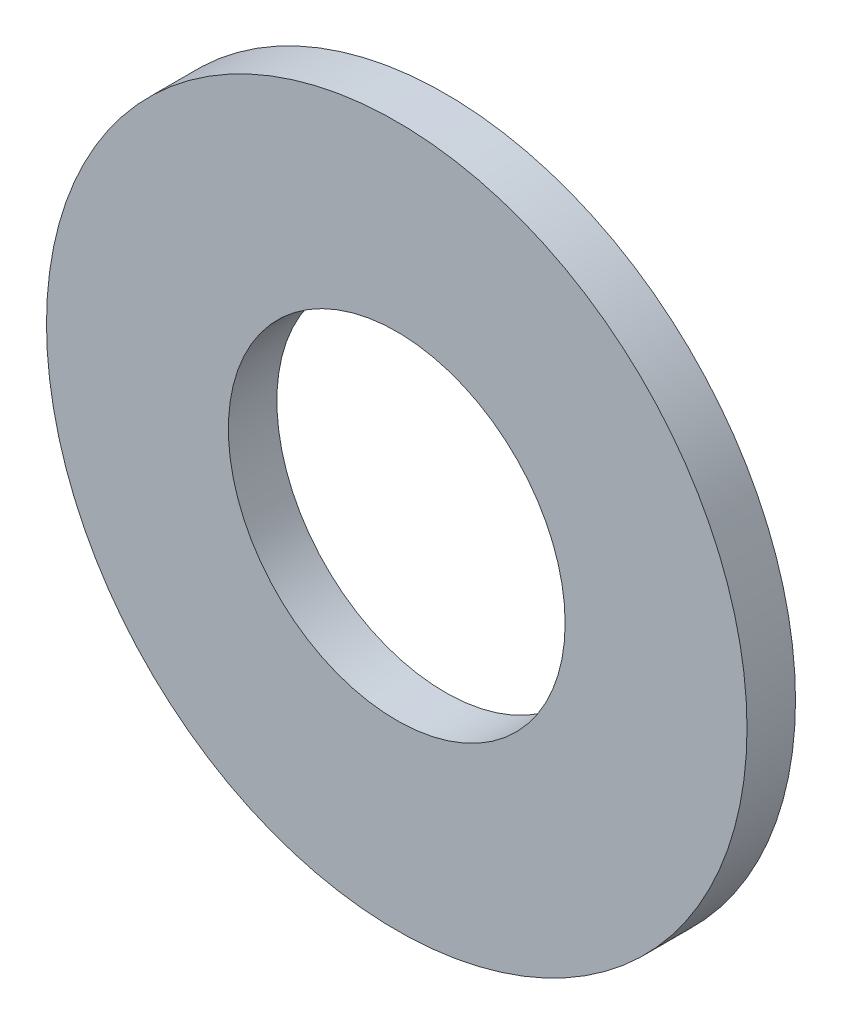
ISO-10303-21;
HEADER;
FILE_DESCRIPTION(('STEP AP214'),'2;1');
FILE_NAME('part.step','',(''),(''),'','','');
FILE_SCHEMA(('AUTOMOTIVE_DESIGN { 1 0 10303 214 1 1 1 1 }'));
ENDSEC;
DATA;
#1=APPLICATION_CONTEXT('core data for automotive mechanical design processes');
#2=APPLICATION_PROTOCOL_DEFINITION('international standard','automotive_design',2000,#1);
#3=PRODUCT_CONTEXT('',#1,'mechanical');
#4=PRODUCT('Part','Part','',(#3));
#5=PRODUCT_RELATED_PRODUCT_CATEGORY('part','',(#4));
#6=PRODUCT_DEFINITION_FORMATION('','',#4);
#7=PRODUCT_DEFINITION_CONTEXT('part definition',#1,'design');
#8=PRODUCT_DEFINITION('design','',#6,#7);
#9=PRODUCT_DEFINITION_SHAPE('','',#8);
#10=(LENGTH_UNIT() NAMED_UNIT(*) SI_UNIT(.MILLI.,.METRE.));
#11=(NAMED_UNIT(*) PLANE_ANGLE_UNIT() SI_UNIT($,.RADIAN.));
#12=(NAMED_UNIT(*) SI_UNIT($,.STERADIAN.) SOLID_ANGLE_UNIT());
#13=UNCERTAINTY_MEASURE_WITH_UNIT(LENGTH_MEASURE(1.E-05),#10,'distance_accuracy_value','');
#14=(GEOMETRIC_REPRESENTATION_CONTEXT(3) GLOBAL_UNCERTAINTY_ASSIGNED_CONTEXT((#13)) GLOBAL_UNIT_ASSIGNED_CONTEXT((#10,
#11,#12)) REPRESENTATION_CONTEXT('',''));
#15=CARTESIAN_POINT('',(0.,0.,0.));
#16=DIRECTION('',(0.,0.,1.));
#17=DIRECTION('',(1.,0.,0.));
#18=AXIS2_PLACEMENT_3D('',#15,#16,#17);
#19=CARTESIAN_POINT('',(0.,0.,3.6));
#20=DIRECTION('',(0.,0.,1.));
#21=DIRECTION('',(1.,0.,0.));
#22=AXIS2_PLACEMENT_3D('',#19,#20,#21);
#23=PLANE('',#22);
#24=CARTESIAN_POINT('',(0.,0.,3.6));
#25=DIRECTION('',(0.,0.,1.));
#26=DIRECTION('',(1.,0.,0.));
#27=AXIS2_PLACEMENT_3D('',#24,#25,#26);
#28=CIRCLE('',#27,26.);
#29=CARTESIAN_POINT('',(26.,0.,3.6));
#30=VERTEX_POINT('',#29);
#31=EDGE_CURVE('E10',#30,#30,#28,.T.);
#32=ORIENTED_EDGE('',*,*,#31,.T.);
#33=EDGE_LOOP('',(#32));
#34=FACE_BOUND('',#33,.T.);
#35=CARTESIAN_POINT('',(0.,0.,3.6));
#36=DIRECTION('',(0.,0.,1.));
#37=DIRECTION('',(1.,0.,0.));
#38=AXIS2_PLACEMENT_3D('',#35,#36,#37);
#39=CIRCLE('',#38,12.5);
#40=CARTESIAN_POINT('',(12.5,0.,3.6));
#41=VERTEX_POINT('',#40);
#42=EDGE_CURVE('E54',#41,#41,#39,.T.);
#43=ORIENTED_EDGE('',*,*,#42,.F.);
#44=EDGE_LOOP('',(#43));
#45=FACE_BOUND('',#44,.T.);
#46=ADVANCED_FACE('F41',(#34,#45),#23,.T.);
#47=CARTESIAN_POINT('',(0.,0.,0.));
#48=DIRECTION('',(0.,0.,1.));
#49=DIRECTION('',(1.,0.,0.));
#50=AXIS2_PLACEMENT_3D('',#47,#48,#49);
#51=PLANE('',#50);
#52=CARTESIAN_POINT('',(0.,0.,0.));
#53=DIRECTION('',(0.,0.,1.));
#54=DIRECTION('',(1.,0.,0.));
#55=AXIS2_PLACEMENT_3D('',#52,#53,#54);
#56=CIRCLE('',#55,26.);
#57=CARTESIAN_POINT('',(26.,0.,0.));
#58=VERTEX_POINT('',#57);
#59=EDGE_CURVE('E45',#58,#58,#56,.T.);
#60=ORIENTED_EDGE('',*,*,#59,.F.);
#61=EDGE_LOOP('',(#60));
#62=FACE_BOUND('',#61,.T.);
#63=CARTESIAN_POINT('',(0.,0.,0.));
#64=DIRECTION('',(0.,0.,1.));
#65=DIRECTION('',(1.,0.,0.));
#66=AXIS2_PLACEMENT_3D('',#63,#64,#65);
#67=CIRCLE('',#66,12.5);
#68=CARTESIAN_POINT('',(12.5,0.,0.));
#69=VERTEX_POINT('',#68);
#70=EDGE_CURVE('E56',#69,#69,#67,.T.);
#71=ORIENTED_EDGE('',*,*,#70,.T.);
#72=EDGE_LOOP('',(#71));
#73=FACE_BOUND('',#72,.T.);
#74=ADVANCED_FACE('F68',(#62,#73),#51,.F.);
#75=CARTESIAN_POINT('',(0.,0.,3.6));
#76=DIRECTION('',(0.,0.,-1.));
#77=DIRECTION('',(-1.,0.,0.));
#78=AXIS2_PLACEMENT_3D('',#75,#76,#77);
#79=CYLINDRICAL_SURFACE('',#78,26.);
#80=ORIENTED_EDGE('',*,*,#31,.F.);
#81=EDGE_LOOP('',(#80));
#82=FACE_BOUND('',#81,.T.);
#83=ORIENTED_EDGE('',*,*,#59,.T.);
#84=EDGE_LOOP('',(#83));
#85=FACE_BOUND('',#84,.T.);
#86=ADVANCED_FACE('F43',(#82,#85),#79,.T.);
#87=CARTESIAN_POINT('',(0.,0.,3.6));
#88=DIRECTION('',(0.,0.,-1.));
#89=DIRECTION('',(-1.,0.,0.));
#90=AXIS2_PLACEMENT_3D('',#87,#88,#89);
#91=CYLINDRICAL_SURFACE('',#90,12.5);
#92=ORIENTED_EDGE('',*,*,#42,.T.);
#93=EDGE_LOOP('',(#92));
#94=FACE_BOUND('',#93,.T.);
#95=ORIENTED_EDGE('',*,*,#70,.F.);
#96=EDGE_LOOP('',(#95));
#97=FACE_BOUND('',#96,.T.);
#98=ADVANCED_FACE('F64',(#94,#97),#91,.F.);
#99=CLOSED_SHELL('',(#46,#74,#86,#98));
#100=MANIFOLD_SOLID_BREP('B2',#99);
#101=ADVANCED_BREP_SHAPE_REPRESENTATION('',(#18,#100),#14);
#102=SHAPE_DEFINITION_REPRESENTATION(#9,#101);
ENDSEC;
END-ISO-10303-21;
